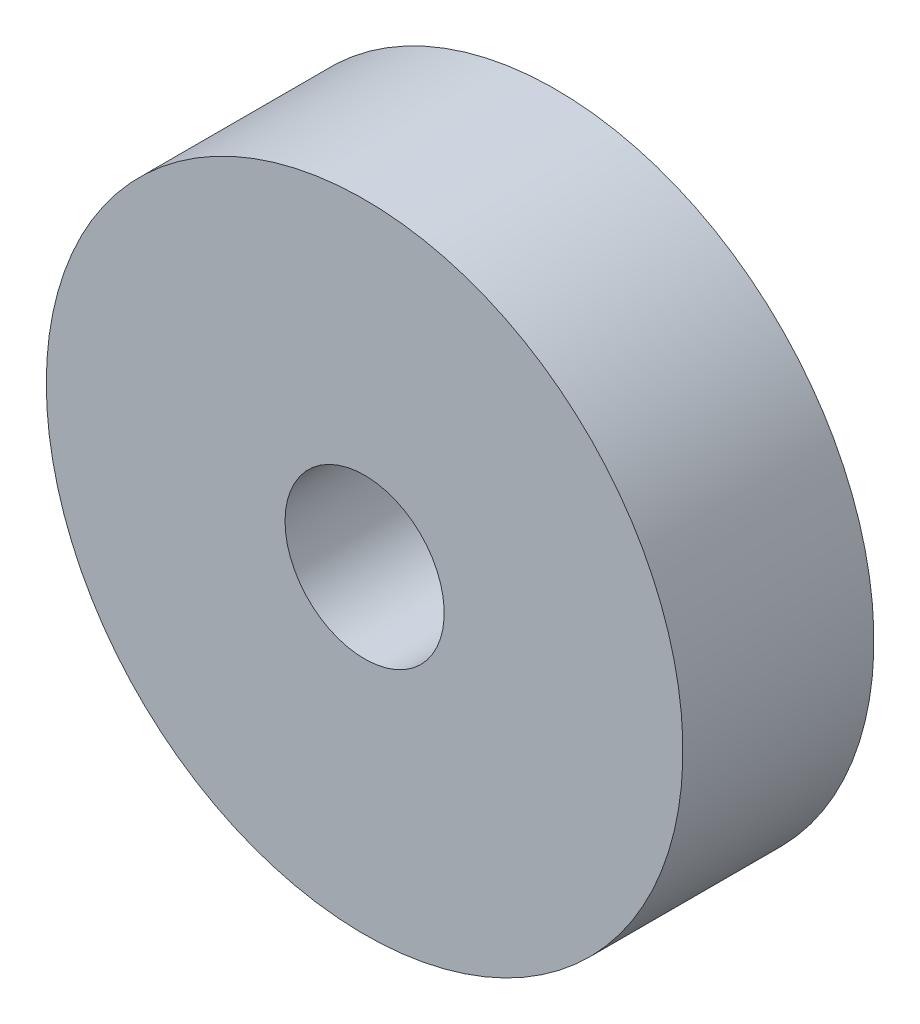
ISO-10303-21;
HEADER;
FILE_DESCRIPTION(('STEP AP214'),'2;1');
FILE_NAME('part.step','',(''),(''),'','','');
FILE_SCHEMA(('AUTOMOTIVE_DESIGN { 1 0 10303 214 1 1 1 1 }'));
ENDSEC;
DATA;
#1=APPLICATION_CONTEXT('core data for automotive mechanical design processes');
#2=APPLICATION_PROTOCOL_DEFINITION('international standard','automotive_design',2000,#1);
#3=PRODUCT_CONTEXT('',#1,'mechanical');
#4=PRODUCT('Part','Part','',(#3));
#5=PRODUCT_RELATED_PRODUCT_CATEGORY('part','',(#4));
#6=PRODUCT_DEFINITION_FORMATION('','',#4);
#7=PRODUCT_DEFINITION_CONTEXT('part definition',#1,'design');
#8=PRODUCT_DEFINITION('design','',#6,#7);
#9=PRODUCT_DEFINITION_SHAPE('','',#8);
#10=(LENGTH_UNIT() NAMED_UNIT(*) SI_UNIT(.MILLI.,.METRE.));
#11=(NAMED_UNIT(*) PLANE_ANGLE_UNIT() SI_UNIT($,.RADIAN.));
#12=(NAMED_UNIT(*) SI_UNIT($,.STERADIAN.) SOLID_ANGLE_UNIT());
#13=UNCERTAINTY_MEASURE_WITH_UNIT(LENGTH_MEASURE(1.E-05),#10,'distance_accuracy_value','');
#14=(GEOMETRIC_REPRESENTATION_CONTEXT(3) GLOBAL_UNCERTAINTY_ASSIGNED_CONTEXT((#13)) GLOBAL_UNIT_ASSIGNED_CONTEXT((#10,
#11,#12)) REPRESENTATION_CONTEXT('',''));
#15=CARTESIAN_POINT('',(0.,0.,0.));
#16=DIRECTION('',(0.,0.,1.));
#17=DIRECTION('',(1.,0.,0.));
#18=AXIS2_PLACEMENT_3D('',#15,#16,#17);
#19=CARTESIAN_POINT('',(0.,0.,9.525));
#20=DIRECTION('',(0.,0.,1.));
#21=DIRECTION('',(1.,0.,0.));
#22=AXIS2_PLACEMENT_3D('',#19,#20,#21);
#23=PLANE('',#22);
#24=CARTESIAN_POINT('',(0.,0.,9.525));
#25=DIRECTION('',(0.,0.,1.));
#26=DIRECTION('',(1.,0.,0.));
#27=AXIS2_PLACEMENT_3D('',#24,#25,#26);
#28=CIRCLE('',#27,15.875);
#29=CARTESIAN_POINT('',(-15.875,0.,9.525));
#30=VERTEX_POINT('',#29);
#31=EDGE_CURVE('E10',#30,#30,#28,.T.);
#32=ORIENTED_EDGE('',*,*,#31,.T.);
#33=EDGE_LOOP('',(#32));
#34=FACE_BOUND('',#33,.T.);
#35=CARTESIAN_POINT('',(0.,0.,9.525));
#36=DIRECTION('',(0.,0.,1.));
#37=DIRECTION('',(1.,0.,0.));
#38=AXIS2_PLACEMENT_3D('',#35,#36,#37);
#39=CIRCLE('',#38,3.96875);
#40=CARTESIAN_POINT('',(-3.96875,0.,9.525));
#41=VERTEX_POINT('',#40);
#42=EDGE_CURVE('E56',#41,#41,#39,.T.);
#43=ORIENTED_EDGE('',*,*,#42,.F.);
#44=EDGE_LOOP('',(#43));
#45=FACE_BOUND('',#44,.T.);
#46=ADVANCED_FACE('F43',(#34,#45),#23,.T.);
#47=CARTESIAN_POINT('',(0.,0.,0.));
#48=DIRECTION('',(0.,0.,1.));
#49=DIRECTION('',(1.,0.,0.));
#50=AXIS2_PLACEMENT_3D('',#47,#48,#49);
#51=PLANE('',#50);
#52=CARTESIAN_POINT('',(0.,0.,0.));
#53=DIRECTION('',(0.,0.,1.));
#54=DIRECTION('',(1.,0.,0.));
#55=AXIS2_PLACEMENT_3D('',#52,#53,#54);
#56=CIRCLE('',#55,15.875);
#57=CARTESIAN_POINT('',(-15.875,0.,0.));
#58=VERTEX_POINT('',#57);
#59=EDGE_CURVE('E47',#58,#58,#56,.T.);
#60=ORIENTED_EDGE('',*,*,#59,.F.);
#61=EDGE_LOOP('',(#60));
#62=FACE_BOUND('',#61,.T.);
#63=CARTESIAN_POINT('',(0.,0.,0.));
#64=DIRECTION('',(0.,0.,1.));
#65=DIRECTION('',(1.,0.,0.));
#66=AXIS2_PLACEMENT_3D('',#63,#64,#65);
#67=CIRCLE('',#66,3.96875);
#68=CARTESIAN_POINT('',(-3.96875,0.,0.));
#69=VERTEX_POINT('',#68);
#70=EDGE_CURVE('E58',#69,#69,#67,.T.);
#71=ORIENTED_EDGE('',*,*,#70,.T.);
#72=EDGE_LOOP('',(#71));
#73=FACE_BOUND('',#72,.T.);
#74=ADVANCED_FACE('F70',(#62,#73),#51,.F.);
#75=CARTESIAN_POINT('',(0.,0.,9.525));
#76=DIRECTION('',(0.,0.,-1.));
#77=DIRECTION('',(-1.,0.,0.));
#78=AXIS2_PLACEMENT_3D('',#75,#76,#77);
#79=CYLINDRICAL_SURFACE('',#78,15.875);
#80=CARTESIAN_POINT('',(-15.875,0.,9.525));
#81=CARTESIAN_POINT('',(-15.875,0.,9.42578125));
#82=CARTESIAN_POINT('',(-15.875,0.,9.3265625));
#83=CARTESIAN_POINT('',(-15.875,0.,9.128125));
#84=CARTESIAN_POINT('',(-15.875,0.,9.02890625));
#85=CARTESIAN_POINT('',(-15.875,0.,8.83046875));
#86=CARTESIAN_POINT('',(-15.875,0.,8.73125));
#87=CARTESIAN_POINT('',(-15.875,0.,8.5328125));
#88=CARTESIAN_POINT('',(-15.875,0.,8.43359375));
#89=CARTESIAN_POINT('',(-15.875,0.,8.23515625));
#90=CARTESIAN_POINT('',(-15.875,0.,8.1359375));
#91=CARTESIAN_POINT('',(-15.875,0.,7.9375));
#92=CARTESIAN_POINT('',(-15.875,0.,7.83828125));
#93=CARTESIAN_POINT('',(-15.875,0.,7.63984375));
#94=CARTESIAN_POINT('',(-15.875,0.,7.540625));
#95=CARTESIAN_POINT('',(-15.875,0.,7.3421875));
#96=CARTESIAN_POINT('',(-15.875,0.,7.24296875));
#97=CARTESIAN_POINT('',(-15.875,0.,7.04453125));
#98=CARTESIAN_POINT('',(-15.875,0.,6.9453125));
#99=CARTESIAN_POINT('',(-15.875,0.,6.746875));
#100=CARTESIAN_POINT('',(-15.875,0.,6.64765625));
#101=CARTESIAN_POINT('',(-15.875,0.,6.44921875));
#102=CARTESIAN_POINT('',(-15.875,0.,6.35));
#103=CARTESIAN_POINT('',(-15.875,0.,6.1515625));
#104=CARTESIAN_POINT('',(-15.875,0.,6.05234375));
#105=CARTESIAN_POINT('',(-15.875,0.,5.85390625));
#106=CARTESIAN_POINT('',(-15.875,0.,5.7546875));
#107=CARTESIAN_POINT('',(-15.875,0.,5.55625));
#108=CARTESIAN_POINT('',(-15.875,0.,5.45703125));
#109=CARTESIAN_POINT('',(-15.875,0.,5.25859375));
#110=CARTESIAN_POINT('',(-15.875,0.,5.159375));
#111=CARTESIAN_POINT('',(-15.875,0.,4.9609375));
#112=CARTESIAN_POINT('',(-15.875,0.,4.86171875));
#113=CARTESIAN_POINT('',(-15.875,0.,4.66328125));
#114=CARTESIAN_POINT('',(-15.875,0.,4.5640625));
#115=CARTESIAN_POINT('',(-15.875,0.,4.365625));
#116=CARTESIAN_POINT('',(-15.875,0.,4.26640625));
#117=CARTESIAN_POINT('',(-15.875,0.,4.06796875));
#118=CARTESIAN_POINT('',(-15.875,0.,3.96875));
#119=CARTESIAN_POINT('',(-15.875,0.,3.7703125));
#120=CARTESIAN_POINT('',(-15.875,0.,3.67109375));
#121=CARTESIAN_POINT('',(-15.875,0.,3.47265625));
#122=CARTESIAN_POINT('',(-15.875,0.,3.3734375));
#123=CARTESIAN_POINT('',(-15.875,0.,3.175));
#124=CARTESIAN_POINT('',(-15.875,0.,3.07578125));
#125=CARTESIAN_POINT('',(-15.875,0.,2.87734375));
#126=CARTESIAN_POINT('',(-15.875,0.,2.778125));
#127=CARTESIAN_POINT('',(-15.875,0.,2.5796875));
#128=CARTESIAN_POINT('',(-15.875,0.,2.48046875));
#129=CARTESIAN_POINT('',(-15.875,0.,2.28203125));
#130=CARTESIAN_POINT('',(-15.875,0.,2.1828125));
#131=CARTESIAN_POINT('',(-15.875,0.,1.984375));
#132=CARTESIAN_POINT('',(-15.875,0.,1.88515625));
#133=CARTESIAN_POINT('',(-15.875,0.,1.68671875));
#134=CARTESIAN_POINT('',(-15.875,0.,1.5875));
#135=CARTESIAN_POINT('',(-15.875,0.,1.3890625));
#136=CARTESIAN_POINT('',(-15.875,0.,1.28984375));
#137=CARTESIAN_POINT('',(-15.875,0.,1.09140625));
#138=CARTESIAN_POINT('',(-15.875,0.,0.992187500000001));
#139=CARTESIAN_POINT('',(-15.875,0.,0.793750000000001));
#140=CARTESIAN_POINT('',(-15.875,0.,0.69453125));
#141=CARTESIAN_POINT('',(-15.875,0.,0.49609375));
#142=CARTESIAN_POINT('',(-15.875,0.,0.396875));
#143=CARTESIAN_POINT('',(-15.875,0.,0.1984375));
#144=CARTESIAN_POINT('',(-15.875,0.,0.0992187500000001));
#145=CARTESIAN_POINT('',(-15.875,0.,0.));
#146=B_SPLINE_CURVE_WITH_KNOTS('',3,(#80,#81,#82,#83,#84,#85,#86,#87,#88,#89,#90,#91,#92,#93,
#94,#95,#96,#97,#98,#99,#100,#101,#102,#103,#104,#105,#106,#107,#108,#109,#110,#111,#112,#113,
#114,#115,#116,#117,#118,#119,#120,#121,#122,#123,#124,#125,#126,#127,#128,#129,#130,#131,#132,
#133,#134,#135,#136,#137,#138,#139,#140,#141,#142,#143,#144,#145),.UNSPECIFIED.,.F.,.F.,(4,2,2,
2,2,2,2,2,2,2,2,2,2,2,2,2,2,2,2,2,2,2,2,2,2,2,2,2,2,2,2,2,4),(0.,0.297656249999998,
0.595312499999999,0.892968749999999,1.190625,1.48828125,1.7859375,2.08359375,2.38125,2.67890625,
2.9765625,3.27421875,3.571875,3.86953125,4.1671875,4.46484375,4.7625,5.06015625,5.3578125,
5.65546875,5.953125,6.25078125,6.5484375,6.84609375,7.14375,7.44140625,7.7390625,8.03671875,
8.334375,8.63203125,8.9296875,9.22734375,9.525),.UNSPECIFIED.);
#147=EDGE_CURVE('BSEAM45',#30,#58,#146,.T.);
#148=ORIENTED_EDGE('',*,*,#31,.F.);
#149=ORIENTED_EDGE('',*,*,#59,.T.);
#150=ORIENTED_EDGE('',*,*,#147,.T.);
#151=ORIENTED_EDGE('',*,*,#147,.F.);
#152=EDGE_LOOP('',(#148,#150,#149,#151));
#153=FACE_BOUND('',#152,.T.);
#154=ADVANCED_FACE('F45',(#153),#79,.T.);
#155=CARTESIAN_POINT('',(0.,0.,9.525));
#156=DIRECTION('',(0.,0.,-1.));
#157=DIRECTION('',(-1.,0.,0.));
#158=AXIS2_PLACEMENT_3D('',#155,#156,#157);
#159=CYLINDRICAL_SURFACE('',#158,3.96875);
#160=CARTESIAN_POINT('',(-3.96875,0.,9.525));
#161=CARTESIAN_POINT('',(-3.96875,0.,9.42578125));
#162=CARTESIAN_POINT('',(-3.96875,0.,9.3265625));
#163=CARTESIAN_POINT('',(-3.96875,0.,9.128125));
#164=CARTESIAN_POINT('',(-3.96875,0.,9.02890625));
#165=CARTESIAN_POINT('',(-3.96875,0.,8.83046875));
#166=CARTESIAN_POINT('',(-3.96875,0.,8.73125));
#167=CARTESIAN_POINT('',(-3.96875,0.,8.5328125));
#168=CARTESIAN_POINT('',(-3.96875,0.,8.43359375));
#169=CARTESIAN_POINT('',(-3.96875,0.,8.23515625));
#170=CARTESIAN_POINT('',(-3.96875,0.,8.1359375));
#171=CARTESIAN_POINT('',(-3.96875,0.,7.9375));
#172=CARTESIAN_POINT('',(-3.96875,0.,7.83828125));
#173=CARTESIAN_POINT('',(-3.96875,0.,7.63984375));
#174=CARTESIAN_POINT('',(-3.96875,0.,7.540625));
#175=CARTESIAN_POINT('',(-3.96875,0.,7.3421875));
#176=CARTESIAN_POINT('',(-3.96875,0.,7.24296875));
#177=CARTESIAN_POINT('',(-3.96875,0.,7.04453125));
#178=CARTESIAN_POINT('',(-3.96875,0.,6.9453125));
#179=CARTESIAN_POINT('',(-3.96875,0.,6.746875));
#180=CARTESIAN_POINT('',(-3.96875,0.,6.64765625));
#181=CARTESIAN_POINT('',(-3.96875,0.,6.44921875));
#182=CARTESIAN_POINT('',(-3.96875,0.,6.35));
#183=CARTESIAN_POINT('',(-3.96875,0.,6.1515625));
#184=CARTESIAN_POINT('',(-3.96875,0.,6.05234375));
#185=CARTESIAN_POINT('',(-3.96875,0.,5.85390625));
#186=CARTESIAN_POINT('',(-3.96875,0.,5.7546875));
#187=CARTESIAN_POINT('',(-3.96875,0.,5.55625));
#188=CARTESIAN_POINT('',(-3.96875,0.,5.45703125));
#189=CARTESIAN_POINT('',(-3.96875,0.,5.25859375));
#190=CARTESIAN_POINT('',(-3.96875,0.,5.159375));
#191=CARTESIAN_POINT('',(-3.96875,0.,4.9609375));
#192=CARTESIAN_POINT('',(-3.96875,0.,4.86171875));
#193=CARTESIAN_POINT('',(-3.96875,0.,4.66328125));
#194=CARTESIAN_POINT('',(-3.96875,0.,4.5640625));
#195=CARTESIAN_POINT('',(-3.96875,0.,4.365625));
#196=CARTESIAN_POINT('',(-3.96875,0.,4.26640625));
#197=CARTESIAN_POINT('',(-3.96875,0.,4.06796875));
#198=CARTESIAN_POINT('',(-3.96875,0.,3.96875));
#199=CARTESIAN_POINT('',(-3.96875,0.,3.7703125));
#200=CARTESIAN_POINT('',(-3.96875,0.,3.67109375));
#201=CARTESIAN_POINT('',(-3.96875,0.,3.47265625));
#202=CARTESIAN_POINT('',(-3.96875,0.,3.3734375));
#203=CARTESIAN_POINT('',(-3.96875,0.,3.175));
#204=CARTESIAN_POINT('',(-3.96875,0.,3.07578125));
#205=CARTESIAN_POINT('',(-3.96875,0.,2.87734375));
#206=CARTESIAN_POINT('',(-3.96875,0.,2.778125));
#207=CARTESIAN_POINT('',(-3.96875,0.,2.5796875));
#208=CARTESIAN_POINT('',(-3.96875,0.,2.48046875));
#209=CARTESIAN_POINT('',(-3.96875,0.,2.28203125));
#210=CARTESIAN_POINT('',(-3.96875,0.,2.1828125));
#211=CARTESIAN_POINT('',(-3.96875,0.,1.984375));
#212=CARTESIAN_POINT('',(-3.96875,0.,1.88515625));
#213=CARTESIAN_POINT('',(-3.96875,0.,1.68671875));
#214=CARTESIAN_POINT('',(-3.96875,0.,1.5875));
#215=CARTESIAN_POINT('',(-3.96875,0.,1.3890625));
#216=CARTESIAN_POINT('',(-3.96875,0.,1.28984375));
#217=CARTESIAN_POINT('',(-3.96875,0.,1.09140625));
#218=CARTESIAN_POINT('',(-3.96875,0.,0.992187500000001));
#219=CARTESIAN_POINT('',(-3.96875,0.,0.793750000000001));
#220=CARTESIAN_POINT('',(-3.96875,0.,0.69453125));
#221=CARTESIAN_POINT('',(-3.96875,0.,0.49609375));
#222=CARTESIAN_POINT('',(-3.96875,0.,0.396875));
#223=CARTESIAN_POINT('',(-3.96875,0.,0.1984375));
#224=CARTESIAN_POINT('',(-3.96875,0.,0.0992187500000001));
#225=CARTESIAN_POINT('',(-3.96875,0.,0.));
#226=B_SPLINE_CURVE_WITH_KNOTS('',3,(#160,#161,#162,#163,#164,#165,#166,#167,#168,#169,#170,
#171,#172,#173,#174,#175,#176,#177,#178,#179,#180,#181,#182,#183,#184,#185,#186,#187,#188,#189,
#190,#191,#192,#193,#194,#195,#196,#197,#198,#199,#200,#201,#202,#203,#204,#205,#206,#207,#208,
#209,#210,#211,#212,#213,#214,#215,#216,#217,#218,#219,#220,#221,#222,#223,#224,#225),
.UNSPECIFIED.,.F.,.F.,(4,2,2,2,2,2,2,2,2,2,2,2,2,2,2,2,2,2,2,2,2,2,2,2,2,2,2,2,2,2,2,2,4),(0.,
0.297656249999998,0.595312499999999,0.892968749999999,1.190625,1.48828125,1.7859375,2.08359375,
2.38125,2.67890625,2.9765625,3.27421875,3.571875,3.86953125,4.1671875,4.46484375,4.7625,
5.06015625,5.3578125,5.65546875,5.953125,6.25078125,6.5484375,6.84609375,7.14375,7.44140625,
7.7390625,8.03671875,8.334375,8.63203125,8.9296875,9.22734375,9.525),.UNSPECIFIED.);
#227=EDGE_CURVE('BSEAM66',#41,#69,#226,.T.);
#228=ORIENTED_EDGE('',*,*,#42,.T.);
#229=ORIENTED_EDGE('',*,*,#70,.F.);
#230=ORIENTED_EDGE('',*,*,#227,.T.);
#231=ORIENTED_EDGE('',*,*,#227,.F.);
#232=EDGE_LOOP('',(#228,#230,#229,#231));
#233=FACE_BOUND('',#232,.T.);
#234=ADVANCED_FACE('F66',(#233),#159,.F.);
#235=CLOSED_SHELL('',(#46,#74,#154,#234));
#236=MANIFOLD_SOLID_BREP('B2',#235);
#237=ADVANCED_BREP_SHAPE_REPRESENTATION('',(#18,#236),#14);
#238=SHAPE_DEFINITION_REPRESENTATION(#9,#237);
ENDSEC;
END-ISO-10303-21;
